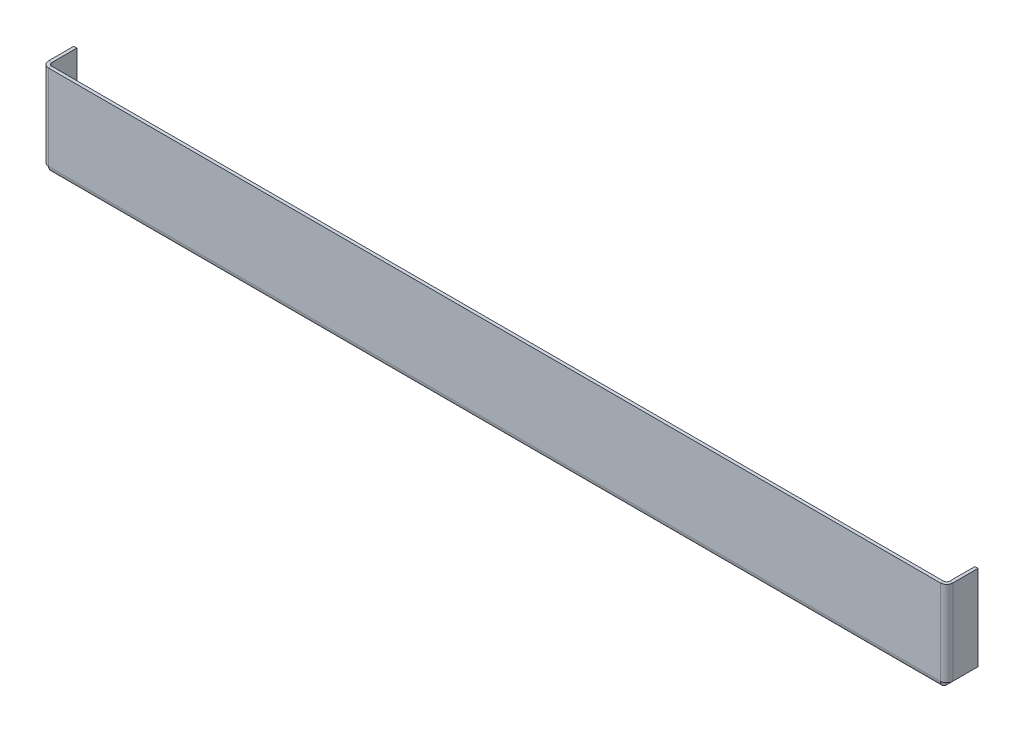
ISO-10303-21;
HEADER;
FILE_DESCRIPTION(('STEP AP214'),'2;1');
FILE_NAME('part.step','',(''),(''),'','','');
FILE_SCHEMA(('AUTOMOTIVE_DESIGN { 1 0 10303 214 1 1 1 1 }'));
ENDSEC;
DATA;
#1=APPLICATION_CONTEXT('core data for automotive mechanical design processes');
#2=APPLICATION_PROTOCOL_DEFINITION('international standard','automotive_design',2000,#1);
#3=PRODUCT_CONTEXT('',#1,'mechanical');
#4=PRODUCT('Part','Part','',(#3));
#5=PRODUCT_RELATED_PRODUCT_CATEGORY('part','',(#4));
#6=PRODUCT_DEFINITION_FORMATION('','',#4);
#7=PRODUCT_DEFINITION_CONTEXT('part definition',#1,'design');
#8=PRODUCT_DEFINITION('design','',#6,#7);
#9=PRODUCT_DEFINITION_SHAPE('','',#8);
#10=(LENGTH_UNIT() NAMED_UNIT(*) SI_UNIT(.MILLI.,.METRE.));
#11=(NAMED_UNIT(*) PLANE_ANGLE_UNIT() SI_UNIT($,.RADIAN.));
#12=(NAMED_UNIT(*) SI_UNIT($,.STERADIAN.) SOLID_ANGLE_UNIT());
#13=UNCERTAINTY_MEASURE_WITH_UNIT(LENGTH_MEASURE(1.E-05),#10,'distance_accuracy_value','');
#14=(GEOMETRIC_REPRESENTATION_CONTEXT(3) GLOBAL_UNCERTAINTY_ASSIGNED_CONTEXT((#13)) GLOBAL_UNIT_ASSIGNED_CONTEXT((#10,
#11,#12)) REPRESENTATION_CONTEXT('',''));
#15=CARTESIAN_POINT('',(0.,0.,0.));
#16=DIRECTION('',(0.,0.,1.));
#17=DIRECTION('',(1.,0.,0.));
#18=AXIS2_PLACEMENT_3D('',#15,#16,#17);
#19=CARTESIAN_POINT('',(0.,40.7,-1.5));
#20=DIRECTION('',(0.,1.,0.));
#21=DIRECTION('',(0.,0.,1.));
#22=AXIS2_PLACEMENT_3D('',#19,#20,#21);
#23=PLANE('',#22);
#24=DIRECTION('',(-1.,0.,0.));
#25=VECTOR('',#24,1.);
#26=CARTESIAN_POINT('',(0.,40.7,0.));
#27=LINE('',#26,#25);
#28=CARTESIAN_POINT('',(426.,40.7,0.));
#29=VERTEX_POINT('',#28);
#30=CARTESIAN_POINT('',(0.,40.7,0.));
#31=VERTEX_POINT('',#30);
#32=EDGE_CURVE('E199',#29,#31,#27,.T.);
#33=ORIENTED_EDGE('',*,*,#32,.F.);
#34=DIRECTION('',(0.,0.,1.));
#35=VECTOR('',#34,1.);
#36=CARTESIAN_POINT('',(426.,40.7,-1.5));
#37=LINE('',#36,#35);
#38=CARTESIAN_POINT('',(426.,40.7,-1.50000000000001));
#39=VERTEX_POINT('',#38);
#40=EDGE_CURVE('E107',#39,#29,#37,.T.);
#41=ORIENTED_EDGE('',*,*,#40,.F.);
#42=DIRECTION('',(-1.,0.,0.));
#43=VECTOR('',#42,1.);
#44=CARTESIAN_POINT('',(0.,40.7,-1.5));
#45=LINE('',#44,#43);
#46=CARTESIAN_POINT('',(0.,40.7,-1.5));
#47=VERTEX_POINT('',#46);
#48=EDGE_CURVE('E205',#39,#47,#45,.T.);
#49=ORIENTED_EDGE('',*,*,#48,.T.);
#50=DIRECTION('',(0.,0.,1.));
#51=VECTOR('',#50,1.);
#52=CARTESIAN_POINT('',(0.,40.7,-1.5));
#53=LINE('',#52,#51);
#54=EDGE_CURVE('E13',#47,#31,#53,.T.);
#55=ORIENTED_EDGE('',*,*,#54,.T.);
#56=EDGE_LOOP('',(#33,#41,#49,#55));
#57=FACE_BOUND('',#56,.T.);
#58=ADVANCED_FACE('F99',(#57),#23,.T.);
#59=CARTESIAN_POINT('',(0.,0.,-1.5));
#60=DIRECTION('',(0.,0.,-1.));
#61=DIRECTION('',(-1.,0.,0.));
#62=AXIS2_PLACEMENT_3D('',#59,#60,#61);
#63=PLANE('',#62);
#64=DIRECTION('',(0.,-1.,0.));
#65=VECTOR('',#64,1.);
#66=CARTESIAN_POINT('',(0.,0.,-1.5));
#67=LINE('',#66,#65);
#68=CARTESIAN_POINT('',(0.,0.,-1.49999999999999));
#69=VERTEX_POINT('',#68);
#70=EDGE_CURVE('E196',#47,#69,#67,.T.);
#71=ORIENTED_EDGE('',*,*,#70,.F.);
#72=ORIENTED_EDGE('',*,*,#48,.F.);
#73=DIRECTION('',(0.,1.,0.));
#74=VECTOR('',#73,1.);
#75=CARTESIAN_POINT('',(426.,0.,-1.5));
#76=LINE('',#75,#74);
#77=CARTESIAN_POINT('',(426.,0.,-1.50000000000001));
#78=VERTEX_POINT('',#77);
#79=EDGE_CURVE('E202',#78,#39,#76,.T.);
#80=ORIENTED_EDGE('',*,*,#79,.F.);
#81=DIRECTION('',(1.,0.,0.));
#82=VECTOR('',#81,1.);
#83=CARTESIAN_POINT('',(0.,0.,-1.5));
#84=LINE('',#83,#82);
#85=EDGE_CURVE('E198',#69,#78,#84,.T.);
#86=ORIENTED_EDGE('',*,*,#85,.F.);
#87=EDGE_LOOP('',(#71,#72,#80,#86));
#88=FACE_BOUND('',#87,.T.);
#89=ADVANCED_FACE('F247',(#88),#63,.T.);
#90=CARTESIAN_POINT('',(0.,0.,0.));
#91=DIRECTION('',(0.,0.,-1.));
#92=DIRECTION('',(-1.,0.,0.));
#93=AXIS2_PLACEMENT_3D('',#90,#91,#92);
#94=PLANE('',#93);
#95=DIRECTION('',(0.,-1.,0.));
#96=VECTOR('',#95,1.);
#97=CARTESIAN_POINT('',(0.,0.,0.));
#98=LINE('',#97,#96);
#99=CARTESIAN_POINT('',(0.,0.,0.));
#100=VERTEX_POINT('',#99);
#101=EDGE_CURVE('E124',#31,#100,#98,.T.);
#102=ORIENTED_EDGE('',*,*,#101,.T.);
#103=DIRECTION('',(1.,0.,0.));
#104=VECTOR('',#103,1.);
#105=CARTESIAN_POINT('',(0.,0.,0.));
#106=LINE('',#105,#104);
#107=CARTESIAN_POINT('',(426.,0.,0.));
#108=VERTEX_POINT('',#107);
#109=EDGE_CURVE('E209',#100,#108,#106,.T.);
#110=ORIENTED_EDGE('',*,*,#109,.T.);
#111=DIRECTION('',(0.,1.,0.));
#112=VECTOR('',#111,1.);
#113=CARTESIAN_POINT('',(426.,0.,0.));
#114=LINE('',#113,#112);
#115=EDGE_CURVE('E212',#108,#29,#114,.T.);
#116=ORIENTED_EDGE('',*,*,#115,.T.);
#117=ORIENTED_EDGE('',*,*,#32,.T.);
#118=EDGE_LOOP('',(#102,#110,#116,#117));
#119=FACE_BOUND('',#118,.T.);
#120=ADVANCED_FACE('F239',(#119),#94,.F.);
#121=CARTESIAN_POINT('',(0.,0.,-3.));
#122=DIRECTION('',(0.,-1.,0.));
#123=DIRECTION('',(1.,0.,0.));
#124=AXIS2_PLACEMENT_3D('',#121,#122,#123);
#125=PLANE('',#124);
#126=DIRECTION('',(1.,0.,0.));
#127=VECTOR('',#126,1.);
#128=CARTESIAN_POINT('',(-3.,0.,-2.99999999999999));
#129=LINE('',#128,#127);
#130=CARTESIAN_POINT('',(-1.5,0.,-2.99999999999999));
#131=VERTEX_POINT('',#130);
#132=CARTESIAN_POINT('',(-3.,0.,-2.99999999999999));
#133=VERTEX_POINT('',#132);
#134=EDGE_CURVE('E155',#131,#133,#129,.F.);
#135=ORIENTED_EDGE('',*,*,#134,.F.);
#136=CARTESIAN_POINT('',(0.,0.,-3.));
#137=DIRECTION('',(0.,1.,0.));
#138=DIRECTION('',(-1.,0.,0.));
#139=AXIS2_PLACEMENT_3D('',#136,#137,#138);
#140=CIRCLE('',#139,1.5);
#141=EDGE_CURVE('E149',#69,#131,#140,.F.);
#142=ORIENTED_EDGE('',*,*,#141,.F.);
#143=DIRECTION('',(0.,0.,1.));
#144=VECTOR('',#143,1.);
#145=CARTESIAN_POINT('',(0.,0.,-1.5));
#146=LINE('',#145,#144);
#147=EDGE_CURVE('E102',#69,#100,#146,.T.);
#148=ORIENTED_EDGE('',*,*,#147,.T.);
#149=CARTESIAN_POINT('',(0.,0.,-3.));
#150=DIRECTION('',(0.,1.,0.));
#151=DIRECTION('',(-1.,0.,0.));
#152=AXIS2_PLACEMENT_3D('',#149,#150,#151);
#153=CIRCLE('',#152,3.);
#154=EDGE_CURVE('E190',#100,#133,#153,.F.);
#155=ORIENTED_EDGE('',*,*,#154,.T.);
#156=EDGE_LOOP('',(#135,#142,#148,#155));
#157=FACE_BOUND('',#156,.T.);
#158=ADVANCED_FACE('F228',(#157),#125,.T.);
#159=CARTESIAN_POINT('',(0.,40.7,-3.));
#160=DIRECTION('',(0.,-1.,0.));
#161=DIRECTION('',(1.,0.,0.));
#162=AXIS2_PLACEMENT_3D('',#159,#160,#161);
#163=PLANE('',#162);
#164=CARTESIAN_POINT('',(0.,40.7,-3.));
#165=DIRECTION('',(0.,1.,0.));
#166=DIRECTION('',(-1.,0.,0.));
#167=AXIS2_PLACEMENT_3D('',#164,#165,#166);
#168=CIRCLE('',#167,1.5);
#169=CARTESIAN_POINT('',(-1.5,40.7,-2.99999999999999));
#170=VERTEX_POINT('',#169);
#171=EDGE_CURVE('E146',#170,#47,#168,.T.);
#172=ORIENTED_EDGE('',*,*,#171,.F.);
#173=DIRECTION('',(1.,0.,0.));
#174=VECTOR('',#173,1.);
#175=CARTESIAN_POINT('',(-1.5,40.7,-2.99999999999999));
#176=LINE('',#175,#174);
#177=CARTESIAN_POINT('',(-3.,40.7,-2.99999999999999));
#178=VERTEX_POINT('',#177);
#179=EDGE_CURVE('E154',#170,#178,#176,.F.);
#180=ORIENTED_EDGE('',*,*,#179,.T.);
#181=CARTESIAN_POINT('',(0.,40.7,-3.));
#182=DIRECTION('',(0.,1.,0.));
#183=DIRECTION('',(-1.,0.,0.));
#184=AXIS2_PLACEMENT_3D('',#181,#182,#183);
#185=CIRCLE('',#184,3.);
#186=EDGE_CURVE('E193',#178,#31,#185,.T.);
#187=ORIENTED_EDGE('',*,*,#186,.T.);
#188=ORIENTED_EDGE('',*,*,#54,.F.);
#189=EDGE_LOOP('',(#172,#180,#187,#188));
#190=FACE_BOUND('',#189,.T.);
#191=ADVANCED_FACE('F160',(#190),#163,.F.);
#192=CARTESIAN_POINT('',(0.,40.7,-3.));
#193=DIRECTION('',(0.,1.,0.));
#194=DIRECTION('',(-1.,0.,0.));
#195=AXIS2_PLACEMENT_3D('',#192,#193,#194);
#196=CYLINDRICAL_SURFACE('',#195,3.);
#197=ORIENTED_EDGE('',*,*,#101,.F.);
#198=ORIENTED_EDGE('',*,*,#186,.F.);
#199=DIRECTION('',(0.,1.,0.));
#200=VECTOR('',#199,1.);
#201=CARTESIAN_POINT('',(-3.,0.,-2.99999999999999));
#202=LINE('',#201,#200);
#203=EDGE_CURVE('E175',#178,#133,#202,.F.);
#204=ORIENTED_EDGE('',*,*,#203,.T.);
#205=ORIENTED_EDGE('',*,*,#154,.F.);
#206=EDGE_LOOP('',(#197,#198,#204,#205));
#207=FACE_BOUND('',#206,.T.);
#208=ADVANCED_FACE('F296',(#207),#196,.T.);
#209=CARTESIAN_POINT('',(0.,40.7,-3.));
#210=DIRECTION('',(0.,1.,0.));
#211=DIRECTION('',(-1.,0.,0.));
#212=AXIS2_PLACEMENT_3D('',#209,#210,#211);
#213=CYLINDRICAL_SURFACE('',#212,1.5);
#214=ORIENTED_EDGE('',*,*,#70,.T.);
#215=ORIENTED_EDGE('',*,*,#141,.T.);
#216=DIRECTION('',(0.,1.,0.));
#217=VECTOR('',#216,1.);
#218=CARTESIAN_POINT('',(-1.5,0.,-2.99999999999999));
#219=LINE('',#218,#217);
#220=EDGE_CURVE('E142',#131,#170,#219,.T.);
#221=ORIENTED_EDGE('',*,*,#220,.T.);
#222=ORIENTED_EDGE('',*,*,#171,.T.);
#223=EDGE_LOOP('',(#214,#215,#221,#222));
#224=FACE_BOUND('',#223,.T.);
#225=ADVANCED_FACE('F145',(#224),#213,.F.);
#226=CARTESIAN_POINT('',(-3.00000000000004,40.7,-15.));
#227=DIRECTION('',(0.,-1.,0.));
#228=DIRECTION('',(0.,0.,-1.));
#229=AXIS2_PLACEMENT_3D('',#226,#227,#228);
#230=PLANE('',#229);
#231=ORIENTED_EDGE('',*,*,#179,.F.);
#232=DIRECTION('',(0.,0.,1.));
#233=VECTOR('',#232,1.);
#234=CARTESIAN_POINT('',(-1.50000000000004,40.7,-15.));
#235=LINE('',#234,#233);
#236=CARTESIAN_POINT('',(-1.50000000000004,40.7,-15.));
#237=VERTEX_POINT('',#236);
#238=EDGE_CURVE('E171',#170,#237,#235,.F.);
#239=ORIENTED_EDGE('',*,*,#238,.T.);
#240=DIRECTION('',(1.,0.,0.));
#241=VECTOR('',#240,1.);
#242=CARTESIAN_POINT('',(-3.00000000000004,40.7,-15.));
#243=LINE('',#242,#241);
#244=CARTESIAN_POINT('',(-3.00000000000004,40.7,-15.));
#245=VERTEX_POINT('',#244);
#246=EDGE_CURVE('E163',#245,#237,#243,.T.);
#247=ORIENTED_EDGE('',*,*,#246,.F.);
#248=DIRECTION('',(0.,0.,-1.));
#249=VECTOR('',#248,1.);
#250=CARTESIAN_POINT('',(-2.99999999999999,40.7,0.));
#251=LINE('',#250,#249);
#252=EDGE_CURVE('E174',#178,#245,#251,.T.);
#253=ORIENTED_EDGE('',*,*,#252,.F.);
#254=EDGE_LOOP('',(#231,#239,#247,#253));
#255=FACE_BOUND('',#254,.T.);
#256=ADVANCED_FACE('F168',(#255),#230,.F.);
#257=CARTESIAN_POINT('',(-2.99999999999999,0.,-1.49999999999999));
#258=DIRECTION('',(0.,1.,0.));
#259=DIRECTION('',(0.,0.,1.));
#260=AXIS2_PLACEMENT_3D('',#257,#258,#259);
#261=PLANE('',#260);
#262=ORIENTED_EDGE('',*,*,#134,.T.);
#263=DIRECTION('',(0.,0.,1.));
#264=VECTOR('',#263,1.);
#265=CARTESIAN_POINT('',(-2.99999999999999,0.,0.));
#266=LINE('',#265,#264);
#267=CARTESIAN_POINT('',(-3.00000000000004,0.,-15.));
#268=VERTEX_POINT('',#267);
#269=EDGE_CURVE('E302',#268,#133,#266,.T.);
#270=ORIENTED_EDGE('',*,*,#269,.F.);
#271=DIRECTION('',(1.,0.,0.));
#272=VECTOR('',#271,1.);
#273=CARTESIAN_POINT('',(-3.00000000000004,0.,-15.));
#274=LINE('',#273,#272);
#275=CARTESIAN_POINT('',(-1.50000000000004,0.,-15.));
#276=VERTEX_POINT('',#275);
#277=EDGE_CURVE('E307',#268,#276,#274,.T.);
#278=ORIENTED_EDGE('',*,*,#277,.T.);
#279=DIRECTION('',(0.,0.,-1.));
#280=VECTOR('',#279,1.);
#281=CARTESIAN_POINT('',(-1.49999999999999,0.,-1.5));
#282=LINE('',#281,#280);
#283=EDGE_CURVE('E182',#276,#131,#282,.F.);
#284=ORIENTED_EDGE('',*,*,#283,.T.);
#285=EDGE_LOOP('',(#262,#270,#278,#284));
#286=FACE_BOUND('',#285,.T.);
#287=ADVANCED_FACE('F313',(#286),#261,.F.);
#288=CARTESIAN_POINT('',(-2.99999999999999,0.,0.));
#289=DIRECTION('',(1.,0.,0.));
#290=DIRECTION('',(0.,0.,-1.));
#291=AXIS2_PLACEMENT_3D('',#288,#289,#290);
#292=PLANE('',#291);
#293=ORIENTED_EDGE('',*,*,#203,.F.);
#294=ORIENTED_EDGE('',*,*,#252,.T.);
#295=DIRECTION('',(0.,-1.,0.));
#296=VECTOR('',#295,1.);
#297=CARTESIAN_POINT('',(-3.00000000000004,0.,-15.));
#298=LINE('',#297,#296);
#299=EDGE_CURVE('E303',#245,#268,#298,.T.);
#300=ORIENTED_EDGE('',*,*,#299,.T.);
#301=ORIENTED_EDGE('',*,*,#269,.T.);
#302=EDGE_LOOP('',(#293,#294,#300,#301));
#303=FACE_BOUND('',#302,.T.);
#304=ADVANCED_FACE('F299',(#303),#292,.F.);
#305=CARTESIAN_POINT('',(-1.49999999999999,0.,0.));
#306=DIRECTION('',(1.,0.,0.));
#307=DIRECTION('',(0.,0.,-1.));
#308=AXIS2_PLACEMENT_3D('',#305,#306,#307);
#309=PLANE('',#308);
#310=ORIENTED_EDGE('',*,*,#238,.F.);
#311=ORIENTED_EDGE('',*,*,#220,.F.);
#312=ORIENTED_EDGE('',*,*,#283,.F.);
#313=DIRECTION('',(0.,1.,0.));
#314=VECTOR('',#313,1.);
#315=CARTESIAN_POINT('',(-1.50000000000004,0.,-15.));
#316=LINE('',#315,#314);
#317=EDGE_CURVE('E179',#237,#276,#316,.F.);
#318=ORIENTED_EDGE('',*,*,#317,.F.);
#319=EDGE_LOOP('',(#310,#311,#312,#318));
#320=FACE_BOUND('',#319,.T.);
#321=ADVANCED_FACE('F177',(#320),#309,.T.);
#322=CARTESIAN_POINT('',(-3.00000000000004,0.,-15.));
#323=DIRECTION('',(0.,0.,1.));
#324=DIRECTION('',(1.,0.,0.));
#325=AXIS2_PLACEMENT_3D('',#322,#323,#324);
#326=PLANE('',#325);
#327=ORIENTED_EDGE('',*,*,#317,.T.);
#328=ORIENTED_EDGE('',*,*,#277,.F.);
#329=ORIENTED_EDGE('',*,*,#299,.F.);
#330=ORIENTED_EDGE('',*,*,#246,.T.);
#331=EDGE_LOOP('',(#327,#328,#329,#330));
#332=FACE_BOUND('',#331,.T.);
#333=ADVANCED_FACE('F315',(#332),#326,.F.);
#334=CARTESIAN_POINT('',(426.,0.,-3.));
#335=DIRECTION('',(1.,0.,0.));
#336=DIRECTION('',(0.,1.,0.));
#337=AXIS2_PLACEMENT_3D('',#334,#335,#336);
#338=PLANE('',#337);
#339=DIRECTION('',(0.,1.,0.));
#340=VECTOR('',#339,1.);
#341=CARTESIAN_POINT('',(426.,-3.,-2.99999999999999));
#342=LINE('',#341,#340);
#343=CARTESIAN_POINT('',(426.,-1.5,-3.));
#344=VERTEX_POINT('',#343);
#345=CARTESIAN_POINT('',(426.,-3.,-2.99999999999999));
#346=VERTEX_POINT('',#345);
#347=EDGE_CURVE('E326',#344,#346,#342,.F.);
#348=ORIENTED_EDGE('',*,*,#347,.F.);
#349=CARTESIAN_POINT('',(426.,0.,-3.));
#350=DIRECTION('',(-1.,0.,0.));
#351=DIRECTION('',(0.,-1.,0.));
#352=AXIS2_PLACEMENT_3D('',#349,#350,#351);
#353=CIRCLE('',#352,1.50000000000002);
#354=EDGE_CURVE('E319',#78,#344,#353,.F.);
#355=ORIENTED_EDGE('',*,*,#354,.F.);
#356=DIRECTION('',(0.,0.,1.));
#357=VECTOR('',#356,1.);
#358=CARTESIAN_POINT('',(426.,0.,-1.5));
#359=LINE('',#358,#357);
#360=EDGE_CURVE('E217',#78,#108,#359,.T.);
#361=ORIENTED_EDGE('',*,*,#360,.T.);
#362=CARTESIAN_POINT('',(426.,0.,-3.));
#363=DIRECTION('',(-1.,0.,0.));
#364=DIRECTION('',(0.,-1.,0.));
#365=AXIS2_PLACEMENT_3D('',#362,#363,#364);
#366=CIRCLE('',#365,3.00000000000001);
#367=EDGE_CURVE('E189',#108,#346,#366,.F.);
#368=ORIENTED_EDGE('',*,*,#367,.T.);
#369=EDGE_LOOP('',(#348,#355,#361,#368));
#370=FACE_BOUND('',#369,.T.);
#371=ADVANCED_FACE('F465',(#370),#338,.T.);
#372=CARTESIAN_POINT('',(0.,0.,-3.));
#373=DIRECTION('',(1.,0.,0.));
#374=DIRECTION('',(0.,1.,0.));
#375=AXIS2_PLACEMENT_3D('',#372,#373,#374);
#376=PLANE('',#375);
#377=CARTESIAN_POINT('',(0.,0.,-3.));
#378=DIRECTION('',(-1.,0.,0.));
#379=DIRECTION('',(0.,-1.,0.));
#380=AXIS2_PLACEMENT_3D('',#377,#378,#379);
#381=CIRCLE('',#380,1.50000000000002);
#382=CARTESIAN_POINT('',(0.,-1.50000000000003,-3.));
#383=VERTEX_POINT('',#382);
#384=EDGE_CURVE('E317',#383,#69,#381,.T.);
#385=ORIENTED_EDGE('',*,*,#384,.F.);
#386=DIRECTION('',(0.,1.,0.));
#387=VECTOR('',#386,1.);
#388=CARTESIAN_POINT('',(0.,-1.5,-3.));
#389=LINE('',#388,#387);
#390=CARTESIAN_POINT('',(0.,-3.,-2.99999999999999));
#391=VERTEX_POINT('',#390);
#392=EDGE_CURVE('E331',#383,#391,#389,.F.);
#393=ORIENTED_EDGE('',*,*,#392,.T.);
#394=CARTESIAN_POINT('',(0.,0.,-3.));
#395=DIRECTION('',(-1.,0.,0.));
#396=DIRECTION('',(0.,-1.,0.));
#397=AXIS2_PLACEMENT_3D('',#394,#395,#396);
#398=CIRCLE('',#397,3.00000000000001);
#399=EDGE_CURVE('E323',#391,#100,#398,.T.);
#400=ORIENTED_EDGE('',*,*,#399,.T.);
#401=ORIENTED_EDGE('',*,*,#147,.F.);
#402=EDGE_LOOP('',(#385,#393,#400,#401));
#403=FACE_BOUND('',#402,.T.);
#404=ADVANCED_FACE('F472',(#403),#376,.F.);
#405=CARTESIAN_POINT('',(0.,0.,-3.));
#406=DIRECTION('',(-1.,0.,0.));
#407=DIRECTION('',(0.,-1.,0.));
#408=AXIS2_PLACEMENT_3D('',#405,#406,#407);
#409=CYLINDRICAL_SURFACE('',#408,3.00000000000001);
#410=ORIENTED_EDGE('',*,*,#109,.F.);
#411=ORIENTED_EDGE('',*,*,#399,.F.);
#412=DIRECTION('',(-1.,0.,0.));
#413=VECTOR('',#412,1.);
#414=CARTESIAN_POINT('',(426.,-3.,-2.99999999999999));
#415=LINE('',#414,#413);
#416=EDGE_CURVE('E334',#391,#346,#415,.F.);
#417=ORIENTED_EDGE('',*,*,#416,.T.);
#418=ORIENTED_EDGE('',*,*,#367,.F.);
#419=EDGE_LOOP('',(#410,#411,#417,#418));
#420=FACE_BOUND('',#419,.T.);
#421=ADVANCED_FACE('F475',(#420),#409,.T.);
#422=CARTESIAN_POINT('',(0.,0.,-3.));
#423=DIRECTION('',(-1.,0.,0.));
#424=DIRECTION('',(0.,-1.,0.));
#425=AXIS2_PLACEMENT_3D('',#422,#423,#424);
#426=CYLINDRICAL_SURFACE('',#425,1.50000000000002);
#427=ORIENTED_EDGE('',*,*,#85,.T.);
#428=ORIENTED_EDGE('',*,*,#354,.T.);
#429=DIRECTION('',(-1.,0.,0.));
#430=VECTOR('',#429,1.);
#431=CARTESIAN_POINT('',(426.,-1.5,-2.99999999999999));
#432=LINE('',#431,#430);
#433=EDGE_CURVE('E329',#344,#383,#432,.T.);
#434=ORIENTED_EDGE('',*,*,#433,.T.);
#435=ORIENTED_EDGE('',*,*,#384,.T.);
#436=EDGE_LOOP('',(#427,#428,#434,#435));
#437=FACE_BOUND('',#436,.T.);
#438=ADVANCED_FACE('F478',(#437),#426,.F.);
#439=CARTESIAN_POINT('',(0.,-3.00000000000004,-15.));
#440=DIRECTION('',(1.,0.,0.));
#441=DIRECTION('',(0.,0.,-1.));
#442=AXIS2_PLACEMENT_3D('',#439,#440,#441);
#443=PLANE('',#442);
#444=ORIENTED_EDGE('',*,*,#392,.F.);
#445=DIRECTION('',(0.,0.,1.));
#446=VECTOR('',#445,1.);
#447=CARTESIAN_POINT('',(0.,-1.50000000000004,-15.));
#448=LINE('',#447,#446);
#449=CARTESIAN_POINT('',(0.,-1.50000000000004,-15.));
#450=VERTEX_POINT('',#449);
#451=EDGE_CURVE('E336',#383,#450,#448,.F.);
#452=ORIENTED_EDGE('',*,*,#451,.T.);
#453=DIRECTION('',(0.,1.,0.));
#454=VECTOR('',#453,1.);
#455=CARTESIAN_POINT('',(0.,-3.00000000000004,-15.));
#456=LINE('',#455,#454);
#457=CARTESIAN_POINT('',(0.,-3.00000000000004,-15.));
#458=VERTEX_POINT('',#457);
#459=EDGE_CURVE('E320',#458,#450,#456,.T.);
#460=ORIENTED_EDGE('',*,*,#459,.F.);
#461=DIRECTION('',(0.,0.,-1.));
#462=VECTOR('',#461,1.);
#463=CARTESIAN_POINT('',(0.,-2.99999999999999,0.));
#464=LINE('',#463,#462);
#465=EDGE_CURVE('E343',#391,#458,#464,.T.);
#466=ORIENTED_EDGE('',*,*,#465,.F.);
#467=EDGE_LOOP('',(#444,#452,#460,#466));
#468=FACE_BOUND('',#467,.T.);
#469=ADVANCED_FACE('F481',(#468),#443,.F.);
#470=CARTESIAN_POINT('',(426.,-2.99999999999999,-1.49999999999999));
#471=DIRECTION('',(-1.,0.,0.));
#472=DIRECTION('',(0.,-1.,0.));
#473=AXIS2_PLACEMENT_3D('',#470,#471,#472);
#474=PLANE('',#473);
#475=ORIENTED_EDGE('',*,*,#347,.T.);
#476=DIRECTION('',(0.,0.,1.));
#477=VECTOR('',#476,1.);
#478=CARTESIAN_POINT('',(426.,-2.99999999999999,0.));
#479=LINE('',#478,#477);
#480=CARTESIAN_POINT('',(426.,-3.00000000000004,-15.));
#481=VERTEX_POINT('',#480);
#482=EDGE_CURVE('E347',#481,#346,#479,.T.);
#483=ORIENTED_EDGE('',*,*,#482,.F.);
#484=DIRECTION('',(0.,1.,0.));
#485=VECTOR('',#484,1.);
#486=CARTESIAN_POINT('',(426.,-3.00000000000004,-15.));
#487=LINE('',#486,#485);
#488=CARTESIAN_POINT('',(426.,-1.50000000000004,-15.));
#489=VERTEX_POINT('',#488);
#490=EDGE_CURVE('E350',#481,#489,#487,.T.);
#491=ORIENTED_EDGE('',*,*,#490,.T.);
#492=DIRECTION('',(0.,0.,-1.));
#493=VECTOR('',#492,1.);
#494=CARTESIAN_POINT('',(426.,-1.49999999999999,-1.5));
#495=LINE('',#494,#493);
#496=EDGE_CURVE('E340',#489,#344,#495,.F.);
#497=ORIENTED_EDGE('',*,*,#496,.T.);
#498=EDGE_LOOP('',(#475,#483,#491,#497));
#499=FACE_BOUND('',#498,.T.);
#500=ADVANCED_FACE('F488',(#499),#474,.F.);
#501=CARTESIAN_POINT('',(0.,-2.99999999999999,0.));
#502=DIRECTION('',(0.,1.,0.));
#503=DIRECTION('',(0.,0.,1.));
#504=AXIS2_PLACEMENT_3D('',#501,#502,#503);
#505=PLANE('',#504);
#506=ORIENTED_EDGE('',*,*,#416,.F.);
#507=ORIENTED_EDGE('',*,*,#465,.T.);
#508=DIRECTION('',(1.,0.,0.));
#509=VECTOR('',#508,1.);
#510=CARTESIAN_POINT('',(0.,-3.00000000000004,-15.));
#511=LINE('',#510,#509);
#512=EDGE_CURVE('E345',#458,#481,#511,.T.);
#513=ORIENTED_EDGE('',*,*,#512,.T.);
#514=ORIENTED_EDGE('',*,*,#482,.T.);
#515=EDGE_LOOP('',(#506,#507,#513,#514));
#516=FACE_BOUND('',#515,.T.);
#517=ADVANCED_FACE('F497',(#516),#505,.F.);
#518=CARTESIAN_POINT('',(0.,-1.49999999999999,0.));
#519=DIRECTION('',(0.,1.,0.));
#520=DIRECTION('',(0.,0.,1.));
#521=AXIS2_PLACEMENT_3D('',#518,#519,#520);
#522=PLANE('',#521);
#523=ORIENTED_EDGE('',*,*,#451,.F.);
#524=ORIENTED_EDGE('',*,*,#433,.F.);
#525=ORIENTED_EDGE('',*,*,#496,.F.);
#526=DIRECTION('',(-1.,0.,0.));
#527=VECTOR('',#526,1.);
#528=CARTESIAN_POINT('',(426.,-1.50000000000004,-15.));
#529=LINE('',#528,#527);
#530=EDGE_CURVE('E338',#450,#489,#529,.F.);
#531=ORIENTED_EDGE('',*,*,#530,.F.);
#532=EDGE_LOOP('',(#523,#524,#525,#531));
#533=FACE_BOUND('',#532,.T.);
#534=ADVANCED_FACE('F493',(#533),#522,.T.);
#535=CARTESIAN_POINT('',(426.,-3.00000000000004,-15.));
#536=DIRECTION('',(0.,0.,1.));
#537=DIRECTION('',(0.,-1.,0.));
#538=AXIS2_PLACEMENT_3D('',#535,#536,#537);
#539=PLANE('',#538);
#540=ORIENTED_EDGE('',*,*,#530,.T.);
#541=ORIENTED_EDGE('',*,*,#490,.F.);
#542=ORIENTED_EDGE('',*,*,#512,.F.);
#543=ORIENTED_EDGE('',*,*,#459,.T.);
#544=EDGE_LOOP('',(#540,#541,#542,#543));
#545=FACE_BOUND('',#544,.T.);
#546=ADVANCED_FACE('F490',(#545),#539,.F.);
#547=CARTESIAN_POINT('',(426.,40.7,-3.00000000000001));
#548=DIRECTION('',(0.,1.,0.));
#549=DIRECTION('',(0.,0.,1.));
#550=AXIS2_PLACEMENT_3D('',#547,#548,#549);
#551=PLANE('',#550);
#552=DIRECTION('',(-1.,0.,0.));
#553=VECTOR('',#552,1.);
#554=CARTESIAN_POINT('',(429.,40.7,-3.));
#555=LINE('',#554,#553);
#556=CARTESIAN_POINT('',(427.5,40.7,-3.));
#557=VERTEX_POINT('',#556);
#558=CARTESIAN_POINT('',(429.,40.7,-3.));
#559=VERTEX_POINT('',#558);
#560=EDGE_CURVE('E364',#557,#559,#555,.F.);
#561=ORIENTED_EDGE('',*,*,#560,.F.);
#562=CARTESIAN_POINT('',(426.,40.7,-3.00000000000001));
#563=DIRECTION('',(0.,-1.,0.));
#564=DIRECTION('',(0.,0.,-1.));
#565=AXIS2_PLACEMENT_3D('',#562,#563,#564);
#566=CIRCLE('',#565,1.5);
#567=EDGE_CURVE('E357',#39,#557,#566,.F.);
#568=ORIENTED_EDGE('',*,*,#567,.F.);
#569=ORIENTED_EDGE('',*,*,#40,.T.);
#570=CARTESIAN_POINT('',(426.,40.7,-3.00000000000001));
#571=DIRECTION('',(0.,-1.,0.));
#572=DIRECTION('',(0.,0.,-1.));
#573=AXIS2_PLACEMENT_3D('',#570,#571,#572);
#574=CIRCLE('',#573,3.);
#575=EDGE_CURVE('E115',#29,#559,#574,.F.);
#576=ORIENTED_EDGE('',*,*,#575,.T.);
#577=EDGE_LOOP('',(#561,#568,#569,#576));
#578=FACE_BOUND('',#577,.T.);
#579=ADVANCED_FACE('F430',(#578),#551,.T.);
#580=CARTESIAN_POINT('',(426.,0.,-3.00000000000001));
#581=DIRECTION('',(0.,1.,0.));
#582=DIRECTION('',(0.,0.,1.));
#583=AXIS2_PLACEMENT_3D('',#580,#581,#582);
#584=PLANE('',#583);
#585=CARTESIAN_POINT('',(426.,0.,-3.00000000000001));
#586=DIRECTION('',(0.,-1.,0.));
#587=DIRECTION('',(0.,0.,-1.));
#588=AXIS2_PLACEMENT_3D('',#585,#586,#587);
#589=CIRCLE('',#588,1.5);
#590=CARTESIAN_POINT('',(427.5,0.,-3.));
#591=VERTEX_POINT('',#590);
#592=EDGE_CURVE('E355',#591,#78,#589,.T.);
#593=ORIENTED_EDGE('',*,*,#592,.F.);
#594=DIRECTION('',(-1.,0.,0.));
#595=VECTOR('',#594,1.);
#596=CARTESIAN_POINT('',(427.5,0.,-3.));
#597=LINE('',#596,#595);
#598=CARTESIAN_POINT('',(429.,0.,-3.));
#599=VERTEX_POINT('',#598);
#600=EDGE_CURVE('E369',#591,#599,#597,.F.);
#601=ORIENTED_EDGE('',*,*,#600,.T.);
#602=CARTESIAN_POINT('',(426.,0.,-3.00000000000001));
#603=DIRECTION('',(0.,-1.,0.));
#604=DIRECTION('',(0.,0.,-1.));
#605=AXIS2_PLACEMENT_3D('',#602,#603,#604);
#606=CIRCLE('',#605,3.);
#607=EDGE_CURVE('E360',#599,#108,#606,.T.);
#608=ORIENTED_EDGE('',*,*,#607,.T.);
#609=ORIENTED_EDGE('',*,*,#360,.F.);
#610=EDGE_LOOP('',(#593,#601,#608,#609));
#611=FACE_BOUND('',#610,.T.);
#612=ADVANCED_FACE('F423',(#611),#584,.F.);
#613=CARTESIAN_POINT('',(426.,0.,-3.00000000000001));
#614=DIRECTION('',(0.,-1.,0.));
#615=DIRECTION('',(1.,0.,0.));
#616=AXIS2_PLACEMENT_3D('',#613,#614,#615);
#617=CYLINDRICAL_SURFACE('',#616,3.);
#618=ORIENTED_EDGE('',*,*,#115,.F.);
#619=ORIENTED_EDGE('',*,*,#607,.F.);
#620=DIRECTION('',(0.,-1.,0.));
#621=VECTOR('',#620,1.);
#622=CARTESIAN_POINT('',(429.,40.7,-3.));
#623=LINE('',#622,#621);
#624=EDGE_CURVE('E372',#599,#559,#623,.F.);
#625=ORIENTED_EDGE('',*,*,#624,.T.);
#626=ORIENTED_EDGE('',*,*,#575,.F.);
#627=EDGE_LOOP('',(#618,#619,#625,#626));
#628=FACE_BOUND('',#627,.T.);
#629=ADVANCED_FACE('F419',(#628),#617,.T.);
#630=CARTESIAN_POINT('',(426.,0.,-3.00000000000001));
#631=DIRECTION('',(0.,-1.,0.));
#632=DIRECTION('',(1.,0.,0.));
#633=AXIS2_PLACEMENT_3D('',#630,#631,#632);
#634=CYLINDRICAL_SURFACE('',#633,1.5);
#635=ORIENTED_EDGE('',*,*,#79,.T.);
#636=ORIENTED_EDGE('',*,*,#567,.T.);
#637=DIRECTION('',(0.,-1.,0.));
#638=VECTOR('',#637,1.);
#639=CARTESIAN_POINT('',(427.5,40.7,-3.));
#640=LINE('',#639,#638);
#641=EDGE_CURVE('E367',#557,#591,#640,.T.);
#642=ORIENTED_EDGE('',*,*,#641,.T.);
#643=ORIENTED_EDGE('',*,*,#592,.T.);
#644=EDGE_LOOP('',(#635,#636,#642,#643));
#645=FACE_BOUND('',#644,.T.);
#646=ADVANCED_FACE('F432',(#645),#634,.F.);
#647=CARTESIAN_POINT('',(429.,0.,-15.));
#648=DIRECTION('',(0.,1.,0.));
#649=DIRECTION('',(0.,0.,1.));
#650=AXIS2_PLACEMENT_3D('',#647,#648,#649);
#651=PLANE('',#650);
#652=ORIENTED_EDGE('',*,*,#600,.F.);
#653=DIRECTION('',(0.,0.,1.));
#654=VECTOR('',#653,1.);
#655=CARTESIAN_POINT('',(427.5,0.,-15.));
#656=LINE('',#655,#654);
#657=CARTESIAN_POINT('',(427.5,0.,-15.));
#658=VERTEX_POINT('',#657);
#659=EDGE_CURVE('E374',#591,#658,#656,.F.);
#660=ORIENTED_EDGE('',*,*,#659,.T.);
#661=DIRECTION('',(-1.,0.,0.));
#662=VECTOR('',#661,1.);
#663=CARTESIAN_POINT('',(429.,0.,-15.));
#664=LINE('',#663,#662);
#665=CARTESIAN_POINT('',(429.,0.,-15.));
#666=VERTEX_POINT('',#665);
#667=EDGE_CURVE('E358',#666,#658,#664,.T.);
#668=ORIENTED_EDGE('',*,*,#667,.F.);
#669=DIRECTION('',(0.,0.,-1.));
#670=VECTOR('',#669,1.);
#671=CARTESIAN_POINT('',(429.,0.,1.75692243863907E-12));
#672=LINE('',#671,#670);
#673=EDGE_CURVE('E383',#599,#666,#672,.T.);
#674=ORIENTED_EDGE('',*,*,#673,.F.);
#675=EDGE_LOOP('',(#652,#660,#668,#674));
#676=FACE_BOUND('',#675,.T.);
#677=ADVANCED_FACE('F410',(#676),#651,.F.);
#678=CARTESIAN_POINT('',(429.,40.7,-1.49999999999999));
#679=DIRECTION('',(0.,-1.,0.));
#680=DIRECTION('',(0.,0.,-1.));
#681=AXIS2_PLACEMENT_3D('',#678,#679,#680);
#682=PLANE('',#681);
#683=ORIENTED_EDGE('',*,*,#560,.T.);
#684=DIRECTION('',(0.,0.,1.));
#685=VECTOR('',#684,1.);
#686=CARTESIAN_POINT('',(429.,40.7,1.73600295849914E-12));
#687=LINE('',#686,#685);
#688=CARTESIAN_POINT('',(429.,40.7,-15.));
#689=VERTEX_POINT('',#688);
#690=EDGE_CURVE('E389',#689,#559,#687,.T.);
#691=ORIENTED_EDGE('',*,*,#690,.F.);
#692=DIRECTION('',(-1.,0.,0.));
#693=VECTOR('',#692,1.);
#694=CARTESIAN_POINT('',(429.,40.7,-15.));
#695=LINE('',#694,#693);
#696=CARTESIAN_POINT('',(427.5,40.7,-15.));
#697=VERTEX_POINT('',#696);
#698=EDGE_CURVE('E392',#689,#697,#695,.T.);
#699=ORIENTED_EDGE('',*,*,#698,.T.);
#700=DIRECTION('',(0.,0.,-1.));
#701=VECTOR('',#700,1.);
#702=CARTESIAN_POINT('',(427.5,40.7,-1.5));
#703=LINE('',#702,#701);
#704=EDGE_CURVE('E380',#697,#557,#703,.F.);
#705=ORIENTED_EDGE('',*,*,#704,.T.);
#706=EDGE_LOOP('',(#683,#691,#699,#705));
#707=FACE_BOUND('',#706,.T.);
#708=ADVANCED_FACE('F427',(#707),#682,.F.);
#709=CARTESIAN_POINT('',(429.,0.,1.75692243863907E-12));
#710=DIRECTION('',(-1.,0.,0.));
#711=DIRECTION('',(0.,0.,1.));
#712=AXIS2_PLACEMENT_3D('',#709,#710,#711);
#713=PLANE('',#712);
#714=ORIENTED_EDGE('',*,*,#624,.F.);
#715=ORIENTED_EDGE('',*,*,#673,.T.);
#716=DIRECTION('',(0.,1.,0.));
#717=VECTOR('',#716,1.);
#718=CARTESIAN_POINT('',(429.,0.,-15.));
#719=LINE('',#718,#717);
#720=EDGE_CURVE('E386',#666,#689,#719,.T.);
#721=ORIENTED_EDGE('',*,*,#720,.T.);
#722=ORIENTED_EDGE('',*,*,#690,.T.);
#723=EDGE_LOOP('',(#714,#715,#721,#722));
#724=FACE_BOUND('',#723,.T.);
#725=ADVANCED_FACE('F424',(#724),#713,.F.);
#726=CARTESIAN_POINT('',(427.5,0.,1.7516852166308E-12));
#727=DIRECTION('',(-1.,0.,0.));
#728=DIRECTION('',(0.,0.,1.));
#729=AXIS2_PLACEMENT_3D('',#726,#727,#728);
#730=PLANE('',#729);
#731=ORIENTED_EDGE('',*,*,#659,.F.);
#732=ORIENTED_EDGE('',*,*,#641,.F.);
#733=ORIENTED_EDGE('',*,*,#704,.F.);
#734=DIRECTION('',(0.,-1.,0.));
#735=VECTOR('',#734,1.);
#736=CARTESIAN_POINT('',(427.5,40.7,-15.));
#737=LINE('',#736,#735);
#738=EDGE_CURVE('E377',#658,#697,#737,.F.);
#739=ORIENTED_EDGE('',*,*,#738,.F.);
#740=EDGE_LOOP('',(#731,#732,#733,#739));
#741=FACE_BOUND('',#740,.T.);
#742=ADVANCED_FACE('F434',(#741),#730,.T.);
#743=CARTESIAN_POINT('',(429.,40.7,-15.));
#744=DIRECTION('',(0.,0.,1.));
#745=DIRECTION('',(1.,0.,0.));
#746=AXIS2_PLACEMENT_3D('',#743,#744,#745);
#747=PLANE('',#746);
#748=ORIENTED_EDGE('',*,*,#738,.T.);
#749=ORIENTED_EDGE('',*,*,#698,.F.);
#750=ORIENTED_EDGE('',*,*,#720,.F.);
#751=ORIENTED_EDGE('',*,*,#667,.T.);
#752=EDGE_LOOP('',(#748,#749,#750,#751));
#753=FACE_BOUND('',#752,.T.);
#754=ADVANCED_FACE('F400',(#753),#747,.F.);
#755=CLOSED_SHELL('',(#58,#89,#120,#158,#191,#208,#225,#256,#287,#304,#321,#333,#371,#404,#421,
#438,#469,#500,#517,#534,#546,#579,#612,#629,#646,#677,#708,#725,#742,#754));
#756=MANIFOLD_SOLID_BREP('B2',#755);
#757=ADVANCED_BREP_SHAPE_REPRESENTATION('',(#18,#756),#14);
#758=SHAPE_DEFINITION_REPRESENTATION(#9,#757);
ENDSEC;
END-ISO-10303-21;
